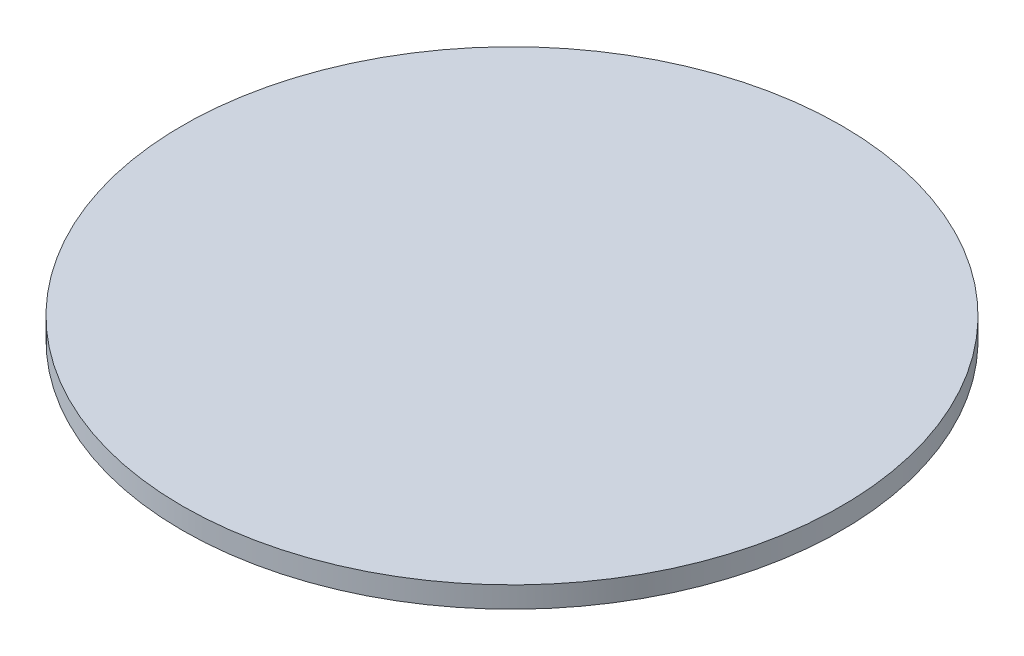
ISO-10303-21;
HEADER;
FILE_DESCRIPTION(('STEP AP214'),'2;1');
FILE_NAME('part.step','',(''),(''),'','','');
FILE_SCHEMA(('AUTOMOTIVE_DESIGN { 1 0 10303 214 1 1 1 1 }'));
ENDSEC;
DATA;
#1=APPLICATION_CONTEXT('core data for automotive mechanical design processes');
#2=APPLICATION_PROTOCOL_DEFINITION('international standard','automotive_design',2000,#1);
#3=PRODUCT_CONTEXT('',#1,'mechanical');
#4=PRODUCT('Part','Part','',(#3));
#5=PRODUCT_RELATED_PRODUCT_CATEGORY('part','',(#4));
#6=PRODUCT_DEFINITION_FORMATION('','',#4);
#7=PRODUCT_DEFINITION_CONTEXT('part definition',#1,'design');
#8=PRODUCT_DEFINITION('design','',#6,#7);
#9=PRODUCT_DEFINITION_SHAPE('','',#8);
#10=(LENGTH_UNIT() NAMED_UNIT(*) SI_UNIT(.MILLI.,.METRE.));
#11=(NAMED_UNIT(*) PLANE_ANGLE_UNIT() SI_UNIT($,.RADIAN.));
#12=(NAMED_UNIT(*) SI_UNIT($,.STERADIAN.) SOLID_ANGLE_UNIT());
#13=UNCERTAINTY_MEASURE_WITH_UNIT(LENGTH_MEASURE(1.E-05),#10,'distance_accuracy_value','');
#14=(GEOMETRIC_REPRESENTATION_CONTEXT(3) GLOBAL_UNCERTAINTY_ASSIGNED_CONTEXT((#13)) GLOBAL_UNIT_ASSIGNED_CONTEXT((#10,
#11,#12)) REPRESENTATION_CONTEXT('',''));
#15=CARTESIAN_POINT('',(0.,0.,0.));
#16=DIRECTION('',(0.,0.,1.));
#17=DIRECTION('',(1.,0.,0.));
#18=AXIS2_PLACEMENT_3D('',#15,#16,#17);
#19=CARTESIAN_POINT('',(0.,1.6,0.));
#20=DIRECTION('',(0.,-1.,0.));
#21=DIRECTION('',(0.,0.,-1.));
#22=AXIS2_PLACEMENT_3D('',#19,#20,#21);
#23=CYLINDRICAL_SURFACE('',#22,25.);
#24=CARTESIAN_POINT('',(0.,1.6,0.));
#25=DIRECTION('',(0.,1.,0.));
#26=DIRECTION('',(0.,0.,1.));
#27=AXIS2_PLACEMENT_3D('',#24,#25,#26);
#28=CIRCLE('',#27,25.);
#29=CARTESIAN_POINT('',(0.,1.6,25.));
#30=VERTEX_POINT('',#29);
#31=EDGE_CURVE('E10',#30,#30,#28,.T.);
#32=ORIENTED_EDGE('',*,*,#31,.F.);
#33=EDGE_LOOP('',(#32));
#34=FACE_BOUND('',#33,.T.);
#35=CARTESIAN_POINT('',(0.,0.,0.));
#36=DIRECTION('',(0.,1.,0.));
#37=DIRECTION('',(0.,0.,1.));
#38=AXIS2_PLACEMENT_3D('',#35,#36,#37);
#39=CIRCLE('',#38,25.);
#40=CARTESIAN_POINT('',(0.,0.,25.));
#41=VERTEX_POINT('',#40);
#42=EDGE_CURVE('E36',#41,#41,#39,.T.);
#43=ORIENTED_EDGE('',*,*,#42,.T.);
#44=EDGE_LOOP('',(#43));
#45=FACE_BOUND('',#44,.T.);
#46=ADVANCED_FACE('F33',(#34,#45),#23,.T.);
#47=CARTESIAN_POINT('',(0.,1.6,0.));
#48=DIRECTION('',(0.,1.,0.));
#49=DIRECTION('',(0.,0.,1.));
#50=AXIS2_PLACEMENT_3D('',#47,#48,#49);
#51=PLANE('',#50);
#52=ORIENTED_EDGE('',*,*,#31,.T.);
#53=EDGE_LOOP('',(#52));
#54=FACE_BOUND('',#53,.T.);
#55=ADVANCED_FACE('F48',(#54),#51,.T.);
#56=CARTESIAN_POINT('',(0.,0.,0.));
#57=DIRECTION('',(0.,1.,0.));
#58=DIRECTION('',(0.,0.,1.));
#59=AXIS2_PLACEMENT_3D('',#56,#57,#58);
#60=PLANE('',#59);
#61=ORIENTED_EDGE('',*,*,#42,.F.);
#62=EDGE_LOOP('',(#61));
#63=FACE_BOUND('',#62,.T.);
#64=ADVANCED_FACE('F46',(#63),#60,.F.);
#65=CLOSED_SHELL('',(#46,#55,#64));
#66=MANIFOLD_SOLID_BREP('B2',#65);
#67=ADVANCED_BREP_SHAPE_REPRESENTATION('',(#18,#66),#14);
#68=SHAPE_DEFINITION_REPRESENTATION(#9,#67);
ENDSEC;
END-ISO-10303-21;
